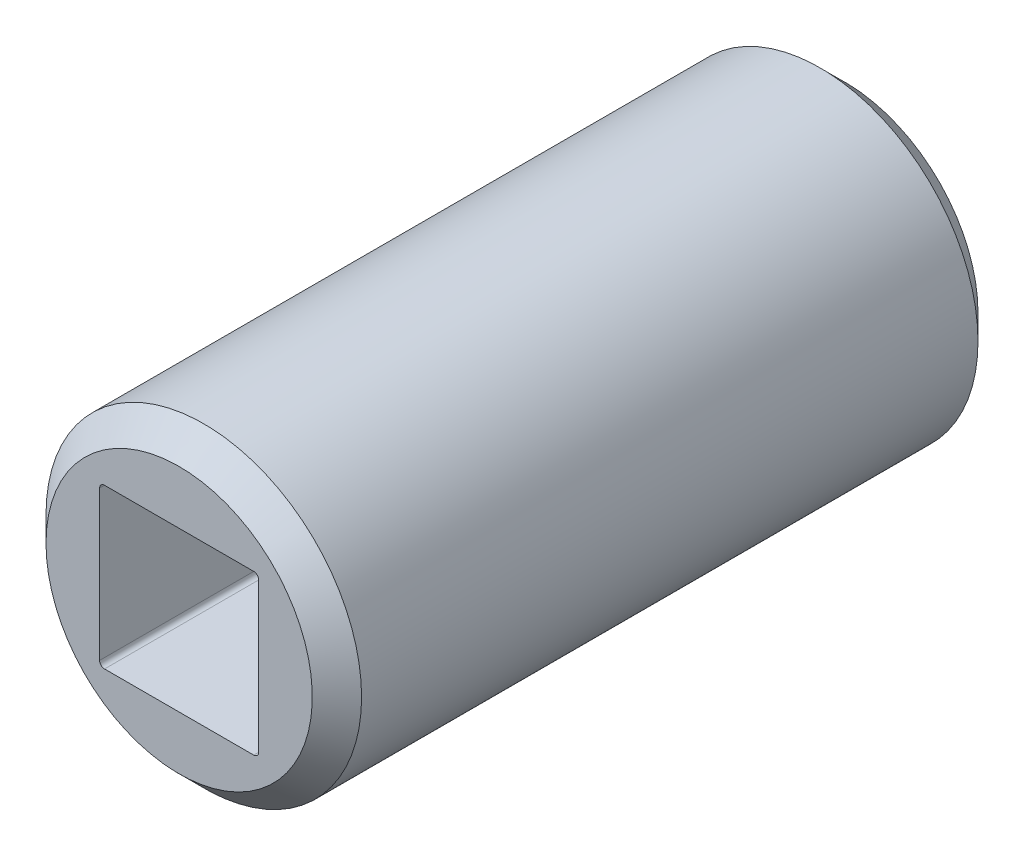
ISO-10303-21;
HEADER;
FILE_DESCRIPTION(('STEP AP214'),'2;1');
FILE_NAME('part.step','',(''),(''),'','','');
FILE_SCHEMA(('AUTOMOTIVE_DESIGN { 1 0 10303 214 1 1 1 1 }'));
ENDSEC;
DATA;
#1=APPLICATION_CONTEXT('core data for automotive mechanical design processes');
#2=APPLICATION_PROTOCOL_DEFINITION('international standard','automotive_design',2000,#1);
#3=PRODUCT_CONTEXT('',#1,'mechanical');
#4=PRODUCT('Part','Part','',(#3));
#5=PRODUCT_RELATED_PRODUCT_CATEGORY('part','',(#4));
#6=PRODUCT_DEFINITION_FORMATION('','',#4);
#7=PRODUCT_DEFINITION_CONTEXT('part definition',#1,'design');
#8=PRODUCT_DEFINITION('design','',#6,#7);
#9=PRODUCT_DEFINITION_SHAPE('','',#8);
#10=(LENGTH_UNIT() NAMED_UNIT(*) SI_UNIT(.MILLI.,.METRE.));
#11=(NAMED_UNIT(*) PLANE_ANGLE_UNIT() SI_UNIT($,.RADIAN.));
#12=(NAMED_UNIT(*) SI_UNIT($,.STERADIAN.) SOLID_ANGLE_UNIT());
#13=UNCERTAINTY_MEASURE_WITH_UNIT(LENGTH_MEASURE(1.E-05),#10,'distance_accuracy_value','');
#14=(GEOMETRIC_REPRESENTATION_CONTEXT(3) GLOBAL_UNCERTAINTY_ASSIGNED_CONTEXT((#13)) GLOBAL_UNIT_ASSIGNED_CONTEXT((#10,
#11,#12)) REPRESENTATION_CONTEXT('',''));
#15=CARTESIAN_POINT('',(0.,0.,0.));
#16=DIRECTION('',(0.,0.,1.));
#17=DIRECTION('',(1.,0.,0.));
#18=AXIS2_PLACEMENT_3D('',#15,#16,#17);
#19=CARTESIAN_POINT('',(0.,0.,6.75));
#20=DIRECTION('',(0.,0.,-1.));
#21=DIRECTION('',(-1.,0.,0.));
#22=AXIS2_PLACEMENT_3D('',#19,#20,#21);
#23=CYLINDRICAL_SURFACE('',#22,1.5875);
#24=CARTESIAN_POINT('',(0.,0.,-1.));
#25=DIRECTION('',(0.,0.,-1.));
#26=DIRECTION('',(-1.,0.,0.));
#27=AXIS2_PLACEMENT_3D('',#24,#25,#26);
#28=CIRCLE('',#27,1.5875);
#29=CARTESIAN_POINT('',(-1.5875,0.,-1.));
#30=VERTEX_POINT('',#29);
#31=EDGE_CURVE('E219',#30,#30,#28,.F.);
#32=ORIENTED_EDGE('',*,*,#31,.F.);
#33=EDGE_LOOP('',(#32));
#34=FACE_BOUND('',#33,.T.);
#35=CARTESIAN_POINT('',(0.,0.,1.));
#36=DIRECTION('',(0.,0.,-1.));
#37=DIRECTION('',(-1.,0.,0.));
#38=AXIS2_PLACEMENT_3D('',#35,#36,#37);
#39=CIRCLE('',#38,1.5875);
#40=CARTESIAN_POINT('',(-1.5875,0.,1.));
#41=VERTEX_POINT('',#40);
#42=EDGE_CURVE('E237',#41,#41,#39,.T.);
#43=ORIENTED_EDGE('',*,*,#42,.F.);
#44=EDGE_LOOP('',(#43));
#45=FACE_BOUND('',#44,.T.);
#46=ADVANCED_FACE('F17',(#34,#45),#23,.F.);
#47=CARTESIAN_POINT('',(1.5129,-1.5129,-4.56197010950313));
#48=DIRECTION('',(0.,0.,-1.));
#49=DIRECTION('',(-1.,0.,0.));
#50=AXIS2_PLACEMENT_3D('',#47,#48,#49);
#51=CYLINDRICAL_SURFACE('',#50,0.1);
#52=DIRECTION('',(0.,0.,-1.));
#53=VECTOR('',#52,1.);
#54=CARTESIAN_POINT('',(1.5129,-1.6129,-4.56197010950313));
#55=LINE('',#54,#53);
#56=CARTESIAN_POINT('',(1.5129,-1.6129,1.));
#57=VERTEX_POINT('',#56);
#58=CARTESIAN_POINT('',(1.5129,-1.6129,6.75));
#59=VERTEX_POINT('',#58);
#60=EDGE_CURVE('E117',#57,#59,#55,.F.);
#61=ORIENTED_EDGE('',*,*,#60,.T.);
#62=CARTESIAN_POINT('',(1.5129,-1.5129,6.75));
#63=DIRECTION('',(0.,0.,-1.));
#64=DIRECTION('',(-1.,0.,0.));
#65=AXIS2_PLACEMENT_3D('',#62,#63,#64);
#66=CIRCLE('',#65,0.1);
#67=CARTESIAN_POINT('',(1.6129,-1.5129,6.75));
#68=VERTEX_POINT('',#67);
#69=EDGE_CURVE('E20',#68,#59,#66,.T.);
#70=ORIENTED_EDGE('',*,*,#69,.F.);
#71=DIRECTION('',(0.,0.,1.));
#72=VECTOR('',#71,1.);
#73=CARTESIAN_POINT('',(1.6129,-1.5129,-4.56197010950313));
#74=LINE('',#73,#72);
#75=CARTESIAN_POINT('',(1.6129,-1.5129,1.));
#76=VERTEX_POINT('',#75);
#77=EDGE_CURVE('E180',#68,#76,#74,.F.);
#78=ORIENTED_EDGE('',*,*,#77,.T.);
#79=CARTESIAN_POINT('',(1.5129,-1.5129,1.));
#80=DIRECTION('',(0.,0.,-1.));
#81=DIRECTION('',(-1.,0.,0.));
#82=AXIS2_PLACEMENT_3D('',#79,#80,#81);
#83=CIRCLE('',#82,0.1);
#84=EDGE_CURVE('E120',#57,#76,#83,.F.);
#85=ORIENTED_EDGE('',*,*,#84,.F.);
#86=EDGE_LOOP('',(#61,#70,#78,#85));
#87=FACE_BOUND('',#86,.T.);
#88=ADVANCED_FACE('F118',(#87),#51,.F.);
#89=CARTESIAN_POINT('',(-1.5129,-1.5129,-4.56197010950313));
#90=DIRECTION('',(0.,0.,-1.));
#91=DIRECTION('',(-1.,0.,0.));
#92=AXIS2_PLACEMENT_3D('',#89,#90,#91);
#93=CYLINDRICAL_SURFACE('',#92,0.1);
#94=DIRECTION('',(0.,0.,1.));
#95=VECTOR('',#94,1.);
#96=CARTESIAN_POINT('',(-1.6129,-1.5129,-4.56197010950313));
#97=LINE('',#96,#95);
#98=CARTESIAN_POINT('',(-1.6129,-1.5129,1.));
#99=VERTEX_POINT('',#98);
#100=CARTESIAN_POINT('',(-1.6129,-1.5129,6.75));
#101=VERTEX_POINT('',#100);
#102=EDGE_CURVE('E169',#99,#101,#97,.T.);
#103=ORIENTED_EDGE('',*,*,#102,.T.);
#104=CARTESIAN_POINT('',(-1.5129,-1.5129,6.75));
#105=DIRECTION('',(0.,0.,-1.));
#106=DIRECTION('',(-1.,0.,0.));
#107=AXIS2_PLACEMENT_3D('',#104,#105,#106);
#108=CIRCLE('',#107,0.1);
#109=CARTESIAN_POINT('',(-1.5129,-1.6129,6.75));
#110=VERTEX_POINT('',#109);
#111=EDGE_CURVE('E115',#110,#101,#108,.T.);
#112=ORIENTED_EDGE('',*,*,#111,.F.);
#113=DIRECTION('',(0.,0.,-1.));
#114=VECTOR('',#113,1.);
#115=CARTESIAN_POINT('',(-1.5129,-1.6129,-4.56197010950313));
#116=LINE('',#115,#114);
#117=CARTESIAN_POINT('',(-1.5129,-1.6129,1.));
#118=VERTEX_POINT('',#117);
#119=EDGE_CURVE('E129',#110,#118,#116,.T.);
#120=ORIENTED_EDGE('',*,*,#119,.T.);
#121=CARTESIAN_POINT('',(-1.5129,-1.5129,1.));
#122=DIRECTION('',(0.,0.,-1.));
#123=DIRECTION('',(-1.,0.,0.));
#124=AXIS2_PLACEMENT_3D('',#121,#122,#123);
#125=CIRCLE('',#124,0.1);
#126=EDGE_CURVE('E228',#99,#118,#125,.F.);
#127=ORIENTED_EDGE('',*,*,#126,.F.);
#128=EDGE_LOOP('',(#103,#112,#120,#127));
#129=FACE_BOUND('',#128,.T.);
#130=ADVANCED_FACE('F246',(#129),#93,.F.);
#131=CARTESIAN_POINT('',(-1.5129,1.5129,-4.56197010950313));
#132=DIRECTION('',(0.,0.,-1.));
#133=DIRECTION('',(-1.,0.,0.));
#134=AXIS2_PLACEMENT_3D('',#131,#132,#133);
#135=CYLINDRICAL_SURFACE('',#134,0.1);
#136=DIRECTION('',(0.,0.,1.));
#137=VECTOR('',#136,1.);
#138=CARTESIAN_POINT('',(-1.5129,1.6129,-4.56197010950313));
#139=LINE('',#138,#137);
#140=CARTESIAN_POINT('',(-1.5129,1.6129,1.));
#141=VERTEX_POINT('',#140);
#142=CARTESIAN_POINT('',(-1.5129,1.6129,6.75));
#143=VERTEX_POINT('',#142);
#144=EDGE_CURVE('E165',#141,#143,#139,.T.);
#145=ORIENTED_EDGE('',*,*,#144,.T.);
#146=CARTESIAN_POINT('',(-1.5129,1.5129,6.75));
#147=DIRECTION('',(0.,0.,-1.));
#148=DIRECTION('',(-1.,0.,0.));
#149=AXIS2_PLACEMENT_3D('',#146,#147,#148);
#150=CIRCLE('',#149,0.1);
#151=CARTESIAN_POINT('',(-1.6129,1.5129,6.75));
#152=VERTEX_POINT('',#151);
#153=EDGE_CURVE('E242',#152,#143,#150,.T.);
#154=ORIENTED_EDGE('',*,*,#153,.F.);
#155=DIRECTION('',(0.,0.,1.));
#156=VECTOR('',#155,1.);
#157=CARTESIAN_POINT('',(-1.6129,1.5129,-4.56197010950313));
#158=LINE('',#157,#156);
#159=CARTESIAN_POINT('',(-1.6129,1.5129,1.));
#160=VERTEX_POINT('',#159);
#161=EDGE_CURVE('E124',#152,#160,#158,.F.);
#162=ORIENTED_EDGE('',*,*,#161,.T.);
#163=CARTESIAN_POINT('',(-1.5129,1.5129,1.));
#164=DIRECTION('',(0.,0.,-1.));
#165=DIRECTION('',(-1.,0.,0.));
#166=AXIS2_PLACEMENT_3D('',#163,#164,#165);
#167=CIRCLE('',#166,0.1);
#168=EDGE_CURVE('E231',#141,#160,#167,.F.);
#169=ORIENTED_EDGE('',*,*,#168,.F.);
#170=EDGE_LOOP('',(#145,#154,#162,#169));
#171=FACE_BOUND('',#170,.T.);
#172=ADVANCED_FACE('F252',(#171),#135,.F.);
#173=CARTESIAN_POINT('',(1.5129,1.5129,-4.56197010950313));
#174=DIRECTION('',(0.,0.,-1.));
#175=DIRECTION('',(-1.,0.,0.));
#176=AXIS2_PLACEMENT_3D('',#173,#174,#175);
#177=CYLINDRICAL_SURFACE('',#176,0.1);
#178=DIRECTION('',(0.,0.,1.));
#179=VECTOR('',#178,1.);
#180=CARTESIAN_POINT('',(1.6129,1.5129,-4.56197010950313));
#181=LINE('',#180,#179);
#182=CARTESIAN_POINT('',(1.6129,1.5129,1.));
#183=VERTEX_POINT('',#182);
#184=CARTESIAN_POINT('',(1.6129,1.5129,6.75));
#185=VERTEX_POINT('',#184);
#186=EDGE_CURVE('E176',#183,#185,#181,.T.);
#187=ORIENTED_EDGE('',*,*,#186,.T.);
#188=CARTESIAN_POINT('',(1.5129,1.5129,6.75));
#189=DIRECTION('',(0.,0.,-1.));
#190=DIRECTION('',(-1.,0.,0.));
#191=AXIS2_PLACEMENT_3D('',#188,#189,#190);
#192=CIRCLE('',#191,0.1);
#193=CARTESIAN_POINT('',(1.5129,1.6129,6.75));
#194=VERTEX_POINT('',#193);
#195=EDGE_CURVE('E240',#194,#185,#192,.T.);
#196=ORIENTED_EDGE('',*,*,#195,.F.);
#197=DIRECTION('',(0.,0.,1.));
#198=VECTOR('',#197,1.);
#199=CARTESIAN_POINT('',(1.5129,1.6129,-4.56197010950313));
#200=LINE('',#199,#198);
#201=CARTESIAN_POINT('',(1.5129,1.6129,1.));
#202=VERTEX_POINT('',#201);
#203=EDGE_CURVE('E168',#194,#202,#200,.F.);
#204=ORIENTED_EDGE('',*,*,#203,.T.);
#205=CARTESIAN_POINT('',(1.5129,1.5129,1.));
#206=DIRECTION('',(0.,0.,-1.));
#207=DIRECTION('',(-1.,0.,0.));
#208=AXIS2_PLACEMENT_3D('',#205,#206,#207);
#209=CIRCLE('',#208,0.1);
#210=EDGE_CURVE('E234',#183,#202,#209,.F.);
#211=ORIENTED_EDGE('',*,*,#210,.F.);
#212=EDGE_LOOP('',(#187,#196,#204,#211));
#213=FACE_BOUND('',#212,.T.);
#214=ADVANCED_FACE('F457',(#213),#177,.F.);
#215=CARTESIAN_POINT('',(0.,0.,1.));
#216=DIRECTION('',(0.,0.,1.));
#217=DIRECTION('',(1.,0.,0.));
#218=AXIS2_PLACEMENT_3D('',#215,#216,#217);
#219=PLANE('',#218);
#220=DIRECTION('',(1.,0.,0.));
#221=VECTOR('',#220,1.);
#222=CARTESIAN_POINT('',(-1.6129,-1.6129,1.));
#223=LINE('',#222,#221);
#224=EDGE_CURVE('E125',#118,#57,#223,.T.);
#225=ORIENTED_EDGE('',*,*,#224,.T.);
#226=ORIENTED_EDGE('',*,*,#84,.T.);
#227=DIRECTION('',(0.,1.,0.));
#228=VECTOR('',#227,1.);
#229=CARTESIAN_POINT('',(1.6129,1.6129,1.));
#230=LINE('',#229,#228);
#231=EDGE_CURVE('E179',#76,#183,#230,.T.);
#232=ORIENTED_EDGE('',*,*,#231,.T.);
#233=ORIENTED_EDGE('',*,*,#210,.T.);
#234=DIRECTION('',(1.,0.,0.));
#235=VECTOR('',#234,1.);
#236=CARTESIAN_POINT('',(-1.6129,1.6129,1.));
#237=LINE('',#236,#235);
#238=EDGE_CURVE('E162',#202,#141,#237,.F.);
#239=ORIENTED_EDGE('',*,*,#238,.T.);
#240=ORIENTED_EDGE('',*,*,#168,.T.);
#241=DIRECTION('',(0.,-1.,0.));
#242=VECTOR('',#241,1.);
#243=CARTESIAN_POINT('',(-1.6129,1.6129,1.));
#244=LINE('',#243,#242);
#245=EDGE_CURVE('E173',#160,#99,#244,.T.);
#246=ORIENTED_EDGE('',*,*,#245,.T.);
#247=ORIENTED_EDGE('',*,*,#126,.T.);
#248=EDGE_LOOP('',(#225,#226,#232,#233,#239,#240,#246,#247));
#249=FACE_BOUND('',#248,.T.);
#250=ORIENTED_EDGE('',*,*,#42,.T.);
#251=EDGE_LOOP('',(#250));
#252=FACE_BOUND('',#251,.T.);
#253=ADVANCED_FACE('F254',(#249,#252),#219,.T.);
#254=CARTESIAN_POINT('',(1.5129,1.5129,4.56197010950313));
#255=DIRECTION('',(0.,0.,1.));
#256=DIRECTION('',(1.,0.,0.));
#257=AXIS2_PLACEMENT_3D('',#254,#255,#256);
#258=CYLINDRICAL_SURFACE('',#257,0.1);
#259=DIRECTION('',(0.,0.,1.));
#260=VECTOR('',#259,1.);
#261=CARTESIAN_POINT('',(1.5129,1.6129,4.56197010950313));
#262=LINE('',#261,#260);
#263=CARTESIAN_POINT('',(1.5129,1.6129,-1.));
#264=VERTEX_POINT('',#263);
#265=CARTESIAN_POINT('',(1.5129,1.6129,-6.75));
#266=VERTEX_POINT('',#265);
#267=EDGE_CURVE('E157',#264,#266,#262,.F.);
#268=ORIENTED_EDGE('',*,*,#267,.T.);
#269=CARTESIAN_POINT('',(1.5129,1.5129,-6.75));
#270=DIRECTION('',(0.,0.,1.));
#271=DIRECTION('',(1.,0.,0.));
#272=AXIS2_PLACEMENT_3D('',#269,#270,#271);
#273=CIRCLE('',#272,0.1);
#274=CARTESIAN_POINT('',(1.6129,1.5129,-6.75));
#275=VERTEX_POINT('',#274);
#276=EDGE_CURVE('E225',#275,#266,#273,.T.);
#277=ORIENTED_EDGE('',*,*,#276,.F.);
#278=DIRECTION('',(0.,0.,1.));
#279=VECTOR('',#278,1.);
#280=CARTESIAN_POINT('',(1.6129,1.5129,4.56197010950313));
#281=LINE('',#280,#279);
#282=CARTESIAN_POINT('',(1.6129,1.5129,-1.));
#283=VERTEX_POINT('',#282);
#284=EDGE_CURVE('E151',#275,#283,#281,.T.);
#285=ORIENTED_EDGE('',*,*,#284,.T.);
#286=CARTESIAN_POINT('',(1.5129,1.5129,-1.));
#287=DIRECTION('',(0.,0.,1.));
#288=DIRECTION('',(1.,0.,0.));
#289=AXIS2_PLACEMENT_3D('',#286,#287,#288);
#290=CIRCLE('',#289,0.1);
#291=EDGE_CURVE('E216',#264,#283,#290,.F.);
#292=ORIENTED_EDGE('',*,*,#291,.F.);
#293=EDGE_LOOP('',(#268,#277,#285,#292));
#294=FACE_BOUND('',#293,.T.);
#295=ADVANCED_FACE('F438',(#294),#258,.F.);
#296=CARTESIAN_POINT('',(1.5129,-1.5129,4.56197010950313));
#297=DIRECTION('',(0.,0.,1.));
#298=DIRECTION('',(1.,0.,0.));
#299=AXIS2_PLACEMENT_3D('',#296,#297,#298);
#300=CYLINDRICAL_SURFACE('',#299,0.1);
#301=DIRECTION('',(0.,0.,1.));
#302=VECTOR('',#301,1.);
#303=CARTESIAN_POINT('',(1.6129,-1.5129,4.56197010950313));
#304=LINE('',#303,#302);
#305=CARTESIAN_POINT('',(1.6129,-1.5129,-1.));
#306=VERTEX_POINT('',#305);
#307=CARTESIAN_POINT('',(1.6129,-1.5129,-6.75));
#308=VERTEX_POINT('',#307);
#309=EDGE_CURVE('E154',#306,#308,#304,.F.);
#310=ORIENTED_EDGE('',*,*,#309,.T.);
#311=CARTESIAN_POINT('',(1.5129,-1.5129,-6.75));
#312=DIRECTION('',(0.,0.,1.));
#313=DIRECTION('',(1.,0.,0.));
#314=AXIS2_PLACEMENT_3D('',#311,#312,#313);
#315=CIRCLE('',#314,0.1);
#316=CARTESIAN_POINT('',(1.5129,-1.6129,-6.75));
#317=VERTEX_POINT('',#316);
#318=EDGE_CURVE('E223',#317,#308,#315,.T.);
#319=ORIENTED_EDGE('',*,*,#318,.F.);
#320=DIRECTION('',(0.,0.,-1.));
#321=VECTOR('',#320,1.);
#322=CARTESIAN_POINT('',(1.5129,-1.6129,4.56197010950313));
#323=LINE('',#322,#321);
#324=CARTESIAN_POINT('',(1.5129,-1.6129,-1.));
#325=VERTEX_POINT('',#324);
#326=EDGE_CURVE('E145',#317,#325,#323,.F.);
#327=ORIENTED_EDGE('',*,*,#326,.T.);
#328=CARTESIAN_POINT('',(1.5129,-1.5129,-1.));
#329=DIRECTION('',(0.,0.,1.));
#330=DIRECTION('',(1.,0.,0.));
#331=AXIS2_PLACEMENT_3D('',#328,#329,#330);
#332=CIRCLE('',#331,0.1);
#333=EDGE_CURVE('E213',#306,#325,#332,.F.);
#334=ORIENTED_EDGE('',*,*,#333,.F.);
#335=EDGE_LOOP('',(#310,#319,#327,#334));
#336=FACE_BOUND('',#335,.T.);
#337=ADVANCED_FACE('F429',(#336),#300,.F.);
#338=CARTESIAN_POINT('',(-1.5129,-1.5129,4.56197010950313));
#339=DIRECTION('',(0.,0.,1.));
#340=DIRECTION('',(1.,0.,0.));
#341=AXIS2_PLACEMENT_3D('',#338,#339,#340);
#342=CYLINDRICAL_SURFACE('',#341,0.1);
#343=DIRECTION('',(0.,0.,-1.));
#344=VECTOR('',#343,1.);
#345=CARTESIAN_POINT('',(-1.5129,-1.6129,4.56197010950313));
#346=LINE('',#345,#344);
#347=CARTESIAN_POINT('',(-1.5129,-1.6129,-1.));
#348=VERTEX_POINT('',#347);
#349=CARTESIAN_POINT('',(-1.5129,-1.6129,-6.75));
#350=VERTEX_POINT('',#349);
#351=EDGE_CURVE('E142',#348,#350,#346,.T.);
#352=ORIENTED_EDGE('',*,*,#351,.T.);
#353=CARTESIAN_POINT('',(-1.5129,-1.5129,-6.75));
#354=DIRECTION('',(0.,0.,1.));
#355=DIRECTION('',(1.,0.,0.));
#356=AXIS2_PLACEMENT_3D('',#353,#354,#355);
#357=CIRCLE('',#356,0.1);
#358=CARTESIAN_POINT('',(-1.6129,-1.5129,-6.75));
#359=VERTEX_POINT('',#358);
#360=EDGE_CURVE('E35',#359,#350,#357,.T.);
#361=ORIENTED_EDGE('',*,*,#360,.F.);
#362=DIRECTION('',(0.,0.,1.));
#363=VECTOR('',#362,1.);
#364=CARTESIAN_POINT('',(-1.6129,-1.5129,4.56197010950313));
#365=LINE('',#364,#363);
#366=CARTESIAN_POINT('',(-1.6129,-1.5129,-1.));
#367=VERTEX_POINT('',#366);
#368=EDGE_CURVE('E139',#359,#367,#365,.T.);
#369=ORIENTED_EDGE('',*,*,#368,.T.);
#370=CARTESIAN_POINT('',(-1.5129,-1.5129,-1.));
#371=DIRECTION('',(0.,0.,1.));
#372=DIRECTION('',(1.,0.,0.));
#373=AXIS2_PLACEMENT_3D('',#370,#371,#372);
#374=CIRCLE('',#373,0.1);
#375=EDGE_CURVE('E210',#348,#367,#374,.F.);
#376=ORIENTED_EDGE('',*,*,#375,.F.);
#377=EDGE_LOOP('',(#352,#361,#369,#376));
#378=FACE_BOUND('',#377,.T.);
#379=ADVANCED_FACE('F419',(#378),#342,.F.);
#380=CARTESIAN_POINT('',(0.,0.,-1.));
#381=DIRECTION('',(0.,0.,-1.));
#382=DIRECTION('',(-1.,0.,0.));
#383=AXIS2_PLACEMENT_3D('',#380,#381,#382);
#384=PLANE('',#383);
#385=DIRECTION('',(0.,-1.,0.));
#386=VECTOR('',#385,1.);
#387=CARTESIAN_POINT('',(-1.6129,1.6129,-1.));
#388=LINE('',#387,#386);
#389=CARTESIAN_POINT('',(-1.6129,1.5129,-1.));
#390=VERTEX_POINT('',#389);
#391=EDGE_CURVE('E141',#367,#390,#388,.F.);
#392=ORIENTED_EDGE('',*,*,#391,.T.);
#393=CARTESIAN_POINT('',(-1.5129,1.5129,-1.));
#394=DIRECTION('',(0.,0.,1.));
#395=DIRECTION('',(1.,0.,0.));
#396=AXIS2_PLACEMENT_3D('',#393,#394,#395);
#397=CIRCLE('',#396,0.1);
#398=CARTESIAN_POINT('',(-1.5129,1.6129,-1.));
#399=VERTEX_POINT('',#398);
#400=EDGE_CURVE('E182',#390,#399,#397,.F.);
#401=ORIENTED_EDGE('',*,*,#400,.T.);
#402=DIRECTION('',(1.,0.,0.));
#403=VECTOR('',#402,1.);
#404=CARTESIAN_POINT('',(-1.6129,1.6129,-1.));
#405=LINE('',#404,#403);
#406=EDGE_CURVE('E161',#399,#264,#405,.T.);
#407=ORIENTED_EDGE('',*,*,#406,.T.);
#408=ORIENTED_EDGE('',*,*,#291,.T.);
#409=DIRECTION('',(0.,1.,0.));
#410=VECTOR('',#409,1.);
#411=CARTESIAN_POINT('',(1.6129,1.6129,-1.));
#412=LINE('',#411,#410);
#413=EDGE_CURVE('E149',#283,#306,#412,.F.);
#414=ORIENTED_EDGE('',*,*,#413,.T.);
#415=ORIENTED_EDGE('',*,*,#333,.T.);
#416=DIRECTION('',(1.,0.,0.));
#417=VECTOR('',#416,1.);
#418=CARTESIAN_POINT('',(-1.6129,-1.6129,-1.));
#419=LINE('',#418,#417);
#420=EDGE_CURVE('E148',#325,#348,#419,.F.);
#421=ORIENTED_EDGE('',*,*,#420,.T.);
#422=ORIENTED_EDGE('',*,*,#375,.T.);
#423=EDGE_LOOP('',(#392,#401,#407,#408,#414,#415,#421,#422));
#424=FACE_BOUND('',#423,.T.);
#425=ORIENTED_EDGE('',*,*,#31,.T.);
#426=EDGE_LOOP('',(#425));
#427=FACE_BOUND('',#426,.T.);
#428=ADVANCED_FACE('F409',(#424,#427),#384,.T.);
#429=CARTESIAN_POINT('',(-1.5129,1.5129,4.56197010950313));
#430=DIRECTION('',(0.,0.,1.));
#431=DIRECTION('',(1.,0.,0.));
#432=AXIS2_PLACEMENT_3D('',#429,#430,#431);
#433=CYLINDRICAL_SURFACE('',#432,0.1);
#434=DIRECTION('',(0.,0.,1.));
#435=VECTOR('',#434,1.);
#436=CARTESIAN_POINT('',(-1.6129,1.5129,4.56197010950313));
#437=LINE('',#436,#435);
#438=CARTESIAN_POINT('',(-1.6129,1.5129,-6.75));
#439=VERTEX_POINT('',#438);
#440=EDGE_CURVE('E135',#390,#439,#437,.F.);
#441=ORIENTED_EDGE('',*,*,#440,.T.);
#442=CARTESIAN_POINT('',(-1.5129,1.5129,-6.75));
#443=DIRECTION('',(0.,0.,1.));
#444=DIRECTION('',(1.,0.,0.));
#445=AXIS2_PLACEMENT_3D('',#442,#443,#444);
#446=CIRCLE('',#445,0.1);
#447=CARTESIAN_POINT('',(-1.5129,1.6129,-6.75));
#448=VERTEX_POINT('',#447);
#449=EDGE_CURVE('E207',#448,#439,#446,.T.);
#450=ORIENTED_EDGE('',*,*,#449,.F.);
#451=DIRECTION('',(0.,0.,1.));
#452=VECTOR('',#451,1.);
#453=CARTESIAN_POINT('',(-1.5129,1.6129,4.56197010950313));
#454=LINE('',#453,#452);
#455=EDGE_CURVE('E158',#448,#399,#454,.T.);
#456=ORIENTED_EDGE('',*,*,#455,.T.);
#457=ORIENTED_EDGE('',*,*,#400,.F.);
#458=EDGE_LOOP('',(#441,#450,#456,#457));
#459=FACE_BOUND('',#458,.T.);
#460=ADVANCED_FACE('F399',(#459),#433,.F.);
#461=CARTESIAN_POINT('',(1.6129,1.6129,-4.56197010950313));
#462=DIRECTION('',(1.,0.,0.));
#463=DIRECTION('',(0.,1.,0.));
#464=AXIS2_PLACEMENT_3D('',#461,#462,#463);
#465=PLANE('',#464);
#466=ORIENTED_EDGE('',*,*,#186,.F.);
#467=ORIENTED_EDGE('',*,*,#231,.F.);
#468=ORIENTED_EDGE('',*,*,#77,.F.);
#469=DIRECTION('',(0.,1.,0.));
#470=VECTOR('',#469,1.);
#471=CARTESIAN_POINT('',(1.6129,0.,6.75));
#472=LINE('',#471,#470);
#473=EDGE_CURVE('E114',#185,#68,#472,.F.);
#474=ORIENTED_EDGE('',*,*,#473,.F.);
#475=EDGE_LOOP('',(#466,#467,#468,#474));
#476=FACE_BOUND('',#475,.T.);
#477=ADVANCED_FACE('F390',(#476),#465,.F.);
#478=CARTESIAN_POINT('',(-1.6129,-1.6129,-4.56197010950313));
#479=DIRECTION('',(0.,-1.,0.));
#480=DIRECTION('',(0.,0.,-1.));
#481=AXIS2_PLACEMENT_3D('',#478,#479,#480);
#482=PLANE('',#481);
#483=ORIENTED_EDGE('',*,*,#60,.F.);
#484=ORIENTED_EDGE('',*,*,#224,.F.);
#485=ORIENTED_EDGE('',*,*,#119,.F.);
#486=DIRECTION('',(1.,0.,0.));
#487=VECTOR('',#486,1.);
#488=CARTESIAN_POINT('',(0.,-1.6129,6.75));
#489=LINE('',#488,#487);
#490=EDGE_CURVE('E112',#59,#110,#489,.F.);
#491=ORIENTED_EDGE('',*,*,#490,.F.);
#492=EDGE_LOOP('',(#483,#484,#485,#491));
#493=FACE_BOUND('',#492,.T.);
#494=ADVANCED_FACE('F128',(#493),#482,.F.);
#495=CARTESIAN_POINT('',(-1.6129,1.6129,-4.56197010950313));
#496=DIRECTION('',(-1.,0.,0.));
#497=DIRECTION('',(0.,-1.,0.));
#498=AXIS2_PLACEMENT_3D('',#495,#496,#497);
#499=PLANE('',#498);
#500=ORIENTED_EDGE('',*,*,#102,.F.);
#501=ORIENTED_EDGE('',*,*,#245,.F.);
#502=ORIENTED_EDGE('',*,*,#161,.F.);
#503=DIRECTION('',(0.,1.,0.));
#504=VECTOR('',#503,1.);
#505=CARTESIAN_POINT('',(-1.6129,0.,6.75));
#506=LINE('',#505,#504);
#507=EDGE_CURVE('E130',#101,#152,#506,.T.);
#508=ORIENTED_EDGE('',*,*,#507,.F.);
#509=EDGE_LOOP('',(#500,#501,#502,#508));
#510=FACE_BOUND('',#509,.T.);
#511=ADVANCED_FACE('F250',(#510),#499,.F.);
#512=CARTESIAN_POINT('',(-1.6129,1.6129,-4.56197010950313));
#513=DIRECTION('',(0.,1.,0.));
#514=DIRECTION('',(0.,0.,1.));
#515=AXIS2_PLACEMENT_3D('',#512,#513,#514);
#516=PLANE('',#515);
#517=ORIENTED_EDGE('',*,*,#203,.F.);
#518=DIRECTION('',(1.,0.,0.));
#519=VECTOR('',#518,1.);
#520=CARTESIAN_POINT('',(0.,1.6129,6.75));
#521=LINE('',#520,#519);
#522=EDGE_CURVE('E133',#143,#194,#521,.T.);
#523=ORIENTED_EDGE('',*,*,#522,.F.);
#524=ORIENTED_EDGE('',*,*,#144,.F.);
#525=ORIENTED_EDGE('',*,*,#238,.F.);
#526=EDGE_LOOP('',(#517,#523,#524,#525));
#527=FACE_BOUND('',#526,.T.);
#528=ADVANCED_FACE('F261',(#527),#516,.F.);
#529=CARTESIAN_POINT('',(-1.6129,1.6129,4.56197010950313));
#530=DIRECTION('',(0.,1.,0.));
#531=DIRECTION('',(0.,0.,1.));
#532=AXIS2_PLACEMENT_3D('',#529,#530,#531);
#533=PLANE('',#532);
#534=ORIENTED_EDGE('',*,*,#267,.F.);
#535=ORIENTED_EDGE('',*,*,#406,.F.);
#536=ORIENTED_EDGE('',*,*,#455,.F.);
#537=DIRECTION('',(1.,0.,0.));
#538=VECTOR('',#537,1.);
#539=CARTESIAN_POINT('',(0.,1.6129,-6.75));
#540=LINE('',#539,#538);
#541=EDGE_CURVE('E262',#448,#266,#540,.T.);
#542=ORIENTED_EDGE('',*,*,#541,.T.);
#543=EDGE_LOOP('',(#534,#535,#536,#542));
#544=FACE_BOUND('',#543,.T.);
#545=ADVANCED_FACE('F355',(#544),#533,.F.);
#546=CARTESIAN_POINT('',(1.6129,1.6129,4.56197010950313));
#547=DIRECTION('',(1.,0.,0.));
#548=DIRECTION('',(0.,1.,0.));
#549=AXIS2_PLACEMENT_3D('',#546,#547,#548);
#550=PLANE('',#549);
#551=ORIENTED_EDGE('',*,*,#284,.F.);
#552=DIRECTION('',(0.,1.,0.));
#553=VECTOR('',#552,1.);
#554=CARTESIAN_POINT('',(1.6129,0.,-6.75));
#555=LINE('',#554,#553);
#556=EDGE_CURVE('E264',#275,#308,#555,.F.);
#557=ORIENTED_EDGE('',*,*,#556,.T.);
#558=ORIENTED_EDGE('',*,*,#309,.F.);
#559=ORIENTED_EDGE('',*,*,#413,.F.);
#560=EDGE_LOOP('',(#551,#557,#558,#559));
#561=FACE_BOUND('',#560,.T.);
#562=ADVANCED_FACE('F345',(#561),#550,.F.);
#563=CARTESIAN_POINT('',(-1.6129,-1.6129,4.56197010950313));
#564=DIRECTION('',(0.,-1.,0.));
#565=DIRECTION('',(0.,0.,-1.));
#566=AXIS2_PLACEMENT_3D('',#563,#564,#565);
#567=PLANE('',#566);
#568=ORIENTED_EDGE('',*,*,#351,.F.);
#569=ORIENTED_EDGE('',*,*,#420,.F.);
#570=ORIENTED_EDGE('',*,*,#326,.F.);
#571=DIRECTION('',(1.,0.,0.));
#572=VECTOR('',#571,1.);
#573=CARTESIAN_POINT('',(0.,-1.6129,-6.75));
#574=LINE('',#573,#572);
#575=EDGE_CURVE('E269',#317,#350,#574,.F.);
#576=ORIENTED_EDGE('',*,*,#575,.T.);
#577=EDGE_LOOP('',(#568,#569,#570,#576));
#578=FACE_BOUND('',#577,.T.);
#579=ADVANCED_FACE('F296',(#578),#567,.F.);
#580=CARTESIAN_POINT('',(-1.6129,1.6129,4.56197010950313));
#581=DIRECTION('',(-1.,0.,0.));
#582=DIRECTION('',(0.,-1.,0.));
#583=AXIS2_PLACEMENT_3D('',#580,#581,#582);
#584=PLANE('',#583);
#585=ORIENTED_EDGE('',*,*,#440,.F.);
#586=ORIENTED_EDGE('',*,*,#391,.F.);
#587=ORIENTED_EDGE('',*,*,#368,.F.);
#588=DIRECTION('',(0.,1.,0.));
#589=VECTOR('',#588,1.);
#590=CARTESIAN_POINT('',(-1.6129,0.,-6.75));
#591=LINE('',#590,#589);
#592=EDGE_CURVE('E204',#359,#439,#591,.T.);
#593=ORIENTED_EDGE('',*,*,#592,.T.);
#594=EDGE_LOOP('',(#585,#586,#587,#593));
#595=FACE_BOUND('',#594,.T.);
#596=ADVANCED_FACE('F287',(#595),#584,.F.);
#597=CARTESIAN_POINT('',(0.,0.,6.75));
#598=DIRECTION('',(0.,0.,1.));
#599=DIRECTION('',(1.,0.,0.));
#600=AXIS2_PLACEMENT_3D('',#597,#598,#599);
#601=PLANE('',#600);
#602=ORIENTED_EDGE('',*,*,#522,.T.);
#603=ORIENTED_EDGE('',*,*,#195,.T.);
#604=ORIENTED_EDGE('',*,*,#473,.T.);
#605=ORIENTED_EDGE('',*,*,#69,.T.);
#606=ORIENTED_EDGE('',*,*,#490,.T.);
#607=ORIENTED_EDGE('',*,*,#111,.T.);
#608=ORIENTED_EDGE('',*,*,#507,.T.);
#609=ORIENTED_EDGE('',*,*,#153,.T.);
#610=EDGE_LOOP('',(#602,#603,#604,#605,#606,#607,#608,#609));
#611=FACE_BOUND('',#610,.T.);
#612=CARTESIAN_POINT('',(0.,0.,6.75000000001091));
#613=DIRECTION('',(0.,0.,-1.));
#614=DIRECTION('',(-1.,0.,0.));
#615=AXIS2_PLACEMENT_3D('',#612,#613,#614);
#616=CIRCLE('',#615,2.70000000006121);
#617=CARTESIAN_POINT('',(-2.70000000006121,0.,6.75000000001091));
#618=VERTEX_POINT('',#617);
#619=EDGE_CURVE('E201',#618,#618,#616,.T.);
#620=ORIENTED_EDGE('',*,*,#619,.F.);
#621=EDGE_LOOP('',(#620));
#622=FACE_BOUND('',#621,.T.);
#623=ADVANCED_FACE('F109',(#611,#622),#601,.T.);
#624=CARTESIAN_POINT('',(0.,0.,-6.75));
#625=DIRECTION('',(0.,0.,1.));
#626=DIRECTION('',(1.,0.,0.));
#627=AXIS2_PLACEMENT_3D('',#624,#625,#626);
#628=PLANE('',#627);
#629=ORIENTED_EDGE('',*,*,#360,.T.);
#630=ORIENTED_EDGE('',*,*,#575,.F.);
#631=ORIENTED_EDGE('',*,*,#318,.T.);
#632=ORIENTED_EDGE('',*,*,#556,.F.);
#633=ORIENTED_EDGE('',*,*,#276,.T.);
#634=ORIENTED_EDGE('',*,*,#541,.F.);
#635=ORIENTED_EDGE('',*,*,#449,.T.);
#636=ORIENTED_EDGE('',*,*,#592,.F.);
#637=EDGE_LOOP('',(#629,#630,#631,#632,#633,#634,#635,#636));
#638=FACE_BOUND('',#637,.T.);
#639=CARTESIAN_POINT('',(0.,0.,-6.75000000001091));
#640=DIRECTION('',(0.,0.,1.));
#641=DIRECTION('',(1.,0.,0.));
#642=AXIS2_PLACEMENT_3D('',#639,#640,#641);
#643=CIRCLE('',#642,2.69999999994752);
#644=CARTESIAN_POINT('',(2.69999999994752,0.,-6.75000000001091));
#645=VERTEX_POINT('',#644);
#646=EDGE_CURVE('E198',#645,#645,#643,.T.);
#647=ORIENTED_EDGE('',*,*,#646,.F.);
#648=EDGE_LOOP('',(#647));
#649=FACE_BOUND('',#648,.T.);
#650=ADVANCED_FACE('F283',(#638,#649),#628,.F.);
#651=CARTESIAN_POINT('',(0.,0.,6.25000000002274));
#652=DIRECTION('',(0.,0.,-1.));
#653=DIRECTION('',(-1.,0.,0.));
#654=AXIS2_PLACEMENT_3D('',#651,#652,#653);
#655=CONICAL_SURFACE('',#654,3.20000000004939,0.785398163397448);
#656=CARTESIAN_POINT('',(0.,0.,6.25));
#657=DIRECTION('',(0.,0.,-1.));
#658=DIRECTION('',(-1.,0.,0.));
#659=AXIS2_PLACEMENT_3D('',#656,#657,#658);
#660=CIRCLE('',#659,3.2);
#661=CARTESIAN_POINT('',(-3.2,0.,6.25));
#662=VERTEX_POINT('',#661);
#663=EDGE_CURVE('E26',#662,#662,#660,.T.);
#664=ORIENTED_EDGE('',*,*,#663,.F.);
#665=EDGE_LOOP('',(#664));
#666=FACE_BOUND('',#665,.T.);
#667=ORIENTED_EDGE('',*,*,#619,.T.);
#668=EDGE_LOOP('',(#667));
#669=FACE_BOUND('',#668,.T.);
#670=ADVANCED_FACE('F279',(#666,#669),#655,.T.);
#671=CARTESIAN_POINT('',(0.,0.,-6.25000000007958));
#672=DIRECTION('',(0.,0.,1.));
#673=DIRECTION('',(1.,0.,0.));
#674=AXIS2_PLACEMENT_3D('',#671,#672,#673);
#675=CONICAL_SURFACE('',#674,3.19999999987886,0.785398163397448);
#676=CARTESIAN_POINT('',(0.,0.,-6.25));
#677=DIRECTION('',(0.,0.,-1.));
#678=DIRECTION('',(-1.,0.,0.));
#679=AXIS2_PLACEMENT_3D('',#676,#677,#678);
#680=CIRCLE('',#679,3.2);
#681=CARTESIAN_POINT('',(-3.2,0.,-6.25));
#682=VERTEX_POINT('',#681);
#683=EDGE_CURVE('E10',#682,#682,#680,.F.);
#684=ORIENTED_EDGE('',*,*,#683,.F.);
#685=EDGE_LOOP('',(#684));
#686=FACE_BOUND('',#685,.T.);
#687=ORIENTED_EDGE('',*,*,#646,.T.);
#688=EDGE_LOOP('',(#687));
#689=FACE_BOUND('',#688,.T.);
#690=ADVANCED_FACE('F282',(#686,#689),#675,.T.);
#691=CARTESIAN_POINT('',(0.,0.,6.75));
#692=DIRECTION('',(0.,0.,-1.));
#693=DIRECTION('',(-1.,0.,0.));
#694=AXIS2_PLACEMENT_3D('',#691,#692,#693);
#695=CYLINDRICAL_SURFACE('',#694,3.2);
#696=ORIENTED_EDGE('',*,*,#683,.T.);
#697=EDGE_LOOP('',(#696));
#698=FACE_BOUND('',#697,.T.);
#699=ORIENTED_EDGE('',*,*,#663,.T.);
#700=EDGE_LOOP('',(#699));
#701=FACE_BOUND('',#700,.T.);
#702=ADVANCED_FACE('F277',(#698,#701),#695,.T.);
#703=CLOSED_SHELL('',(#46,#88,#130,#172,#214,#253,#295,#337,#379,#428,#460,#477,#494,#511,#528,
#545,#562,#579,#596,#623,#650,#670,#690,#702));
#704=MANIFOLD_SOLID_BREP('B1',#703);
#705=ADVANCED_BREP_SHAPE_REPRESENTATION('',(#18,#704),#14);
#706=SHAPE_DEFINITION_REPRESENTATION(#9,#705);
ENDSEC;
END-ISO-10303-21;
